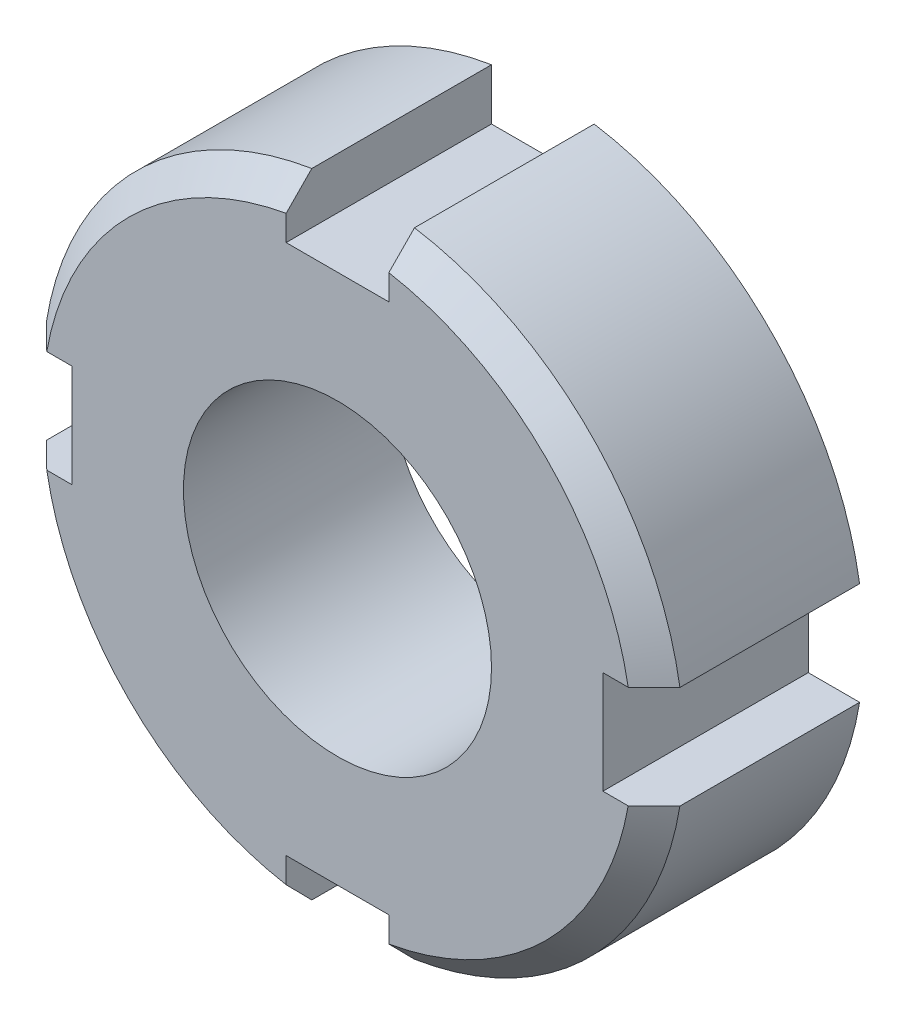
ISO-10303-21;
HEADER;
FILE_DESCRIPTION(('STEP AP214'),'2;1');
FILE_NAME('part.step','',(''),(''),'','','');
FILE_SCHEMA(('AUTOMOTIVE_DESIGN { 1 0 10303 214 1 1 1 1 }'));
ENDSEC;
DATA;
#1=APPLICATION_CONTEXT('core data for automotive mechanical design processes');
#2=APPLICATION_PROTOCOL_DEFINITION('international standard','automotive_design',2000,#1);
#3=PRODUCT_CONTEXT('',#1,'mechanical');
#4=PRODUCT('Part','Part','',(#3));
#5=PRODUCT_RELATED_PRODUCT_CATEGORY('part','',(#4));
#6=PRODUCT_DEFINITION_FORMATION('','',#4);
#7=PRODUCT_DEFINITION_CONTEXT('part definition',#1,'design');
#8=PRODUCT_DEFINITION('design','',#6,#7);
#9=PRODUCT_DEFINITION_SHAPE('','',#8);
#10=(LENGTH_UNIT() NAMED_UNIT(*) SI_UNIT(.MILLI.,.METRE.));
#11=(NAMED_UNIT(*) PLANE_ANGLE_UNIT() SI_UNIT($,.RADIAN.));
#12=(NAMED_UNIT(*) SI_UNIT($,.STERADIAN.) SOLID_ANGLE_UNIT());
#13=UNCERTAINTY_MEASURE_WITH_UNIT(LENGTH_MEASURE(1.E-05),#10,'distance_accuracy_value','');
#14=(GEOMETRIC_REPRESENTATION_CONTEXT(3) GLOBAL_UNCERTAINTY_ASSIGNED_CONTEXT((#13)) GLOBAL_UNIT_ASSIGNED_CONTEXT((#10,
#11,#12)) REPRESENTATION_CONTEXT('',''));
#15=CARTESIAN_POINT('',(0.,0.,0.));
#16=DIRECTION('',(0.,0.,1.));
#17=DIRECTION('',(1.,0.,0.));
#18=AXIS2_PLACEMENT_3D('',#15,#16,#17);
#19=CARTESIAN_POINT('',(0.,0.,8.));
#20=DIRECTION('',(0.,0.,-1.));
#21=DIRECTION('',(-1.,0.,0.));
#22=AXIS2_PLACEMENT_3D('',#19,#20,#21);
#23=CYLINDRICAL_SURFACE('',#22,12.5);
#24=DIRECTION('',(0.,0.,1.));
#25=VECTOR('',#24,1.);
#26=CARTESIAN_POINT('',(-12.338962679254,1.99999999999911,0.));
#27=LINE('',#26,#25);
#28=CARTESIAN_POINT('',(-12.338962679254,1.99999999999911,0.));
#29=VERTEX_POINT('',#28);
#30=CARTESIAN_POINT('',(-12.338962679254,1.99999999999911,6.99999999999999));
#31=VERTEX_POINT('',#30);
#32=EDGE_CURVE('E489',#29,#31,#27,.T.);
#33=ORIENTED_EDGE('',*,*,#32,.T.);
#34=CARTESIAN_POINT('',(0.,0.,6.99999999999999));
#35=DIRECTION('',(0.,0.,1.));
#36=DIRECTION('',(1.,0.,0.));
#37=AXIS2_PLACEMENT_3D('',#34,#35,#36);
#38=CIRCLE('',#37,12.5);
#39=CARTESIAN_POINT('',(-2.,12.3389626792531,6.99999999999999));
#40=VERTEX_POINT('',#39);
#41=EDGE_CURVE('E212',#31,#40,#38,.F.);
#42=ORIENTED_EDGE('',*,*,#41,.T.);
#43=DIRECTION('',(0.,0.,1.));
#44=VECTOR('',#43,1.);
#45=CARTESIAN_POINT('',(-2.,12.3389626792531,0.));
#46=LINE('',#45,#44);
#47=CARTESIAN_POINT('',(-2.,12.3389626792531,0.));
#48=VERTEX_POINT('',#47);
#49=EDGE_CURVE('E197',#48,#40,#46,.T.);
#50=ORIENTED_EDGE('',*,*,#49,.F.);
#51=CARTESIAN_POINT('',(0.,0.,0.));
#52=DIRECTION('',(0.,0.,1.));
#53=DIRECTION('',(1.,0.,0.));
#54=AXIS2_PLACEMENT_3D('',#51,#52,#53);
#55=CIRCLE('',#54,12.5);
#56=EDGE_CURVE('E215',#48,#29,#55,.T.);
#57=ORIENTED_EDGE('',*,*,#56,.T.);
#58=EDGE_LOOP('',(#33,#42,#50,#57));
#59=FACE_BOUND('',#58,.T.);
#60=ADVANCED_FACE('F49',(#59),#23,.T.);
#61=DIRECTION('',(0.,0.,1.));
#62=VECTOR('',#61,1.);
#63=CARTESIAN_POINT('',(2.,12.3389626792531,0.));
#64=LINE('',#63,#62);
#65=CARTESIAN_POINT('',(2.,12.3389626792531,0.));
#66=VERTEX_POINT('',#65);
#67=CARTESIAN_POINT('',(2.,12.3389626792531,6.99999999999999));
#68=VERTEX_POINT('',#67);
#69=EDGE_CURVE('E360',#66,#68,#64,.T.);
#70=ORIENTED_EDGE('',*,*,#69,.T.);
#71=CARTESIAN_POINT('',(0.,0.,6.99999999999999));
#72=DIRECTION('',(0.,0.,1.));
#73=DIRECTION('',(1.,0.,0.));
#74=AXIS2_PLACEMENT_3D('',#71,#72,#73);
#75=CIRCLE('',#74,12.5);
#76=CARTESIAN_POINT('',(12.338962679254,1.99999999999912,6.99999999999999));
#77=VERTEX_POINT('',#76);
#78=EDGE_CURVE('E68',#68,#77,#75,.F.);
#79=ORIENTED_EDGE('',*,*,#78,.T.);
#80=DIRECTION('',(0.,0.,1.));
#81=VECTOR('',#80,1.);
#82=CARTESIAN_POINT('',(12.338962679254,1.99999999999912,0.));
#83=LINE('',#82,#81);
#84=CARTESIAN_POINT('',(12.338962679254,1.99999999999912,0.));
#85=VERTEX_POINT('',#84);
#86=EDGE_CURVE('E399',#85,#77,#83,.T.);
#87=ORIENTED_EDGE('',*,*,#86,.F.);
#88=EDGE_CURVE('E224',#85,#66,#55,.T.);
#89=ORIENTED_EDGE('',*,*,#88,.T.);
#90=EDGE_LOOP('',(#70,#79,#87,#89));
#91=FACE_BOUND('',#90,.T.);
#92=ADVANCED_FACE('F346',(#91),#23,.T.);
#93=DIRECTION('',(0.,0.,1.));
#94=VECTOR('',#93,1.);
#95=CARTESIAN_POINT('',(12.338962679254,-2.00000000000088,0.));
#96=LINE('',#95,#94);
#97=CARTESIAN_POINT('',(12.338962679254,-2.00000000000088,0.));
#98=VERTEX_POINT('',#97);
#99=CARTESIAN_POINT('',(12.338962679254,-2.00000000000088,7.));
#100=VERTEX_POINT('',#99);
#101=EDGE_CURVE('E419',#98,#100,#96,.T.);
#102=ORIENTED_EDGE('',*,*,#101,.T.);
#103=CARTESIAN_POINT('',(0.,0.,7.));
#104=DIRECTION('',(0.,0.,1.));
#105=DIRECTION('',(1.,0.,0.));
#106=AXIS2_PLACEMENT_3D('',#103,#104,#105);
#107=CIRCLE('',#106,12.5);
#108=CARTESIAN_POINT('',(2.,-12.3389626792548,7.));
#109=VERTEX_POINT('',#108);
#110=EDGE_CURVE('E257',#100,#109,#107,.F.);
#111=ORIENTED_EDGE('',*,*,#110,.T.);
#112=DIRECTION('',(0.,0.,1.));
#113=VECTOR('',#112,1.);
#114=CARTESIAN_POINT('',(2.,-12.3389626792548,0.));
#115=LINE('',#114,#113);
#116=CARTESIAN_POINT('',(2.,-12.3389626792548,0.));
#117=VERTEX_POINT('',#116);
#118=EDGE_CURVE('E445',#117,#109,#115,.T.);
#119=ORIENTED_EDGE('',*,*,#118,.F.);
#120=EDGE_CURVE('E228',#117,#98,#55,.T.);
#121=ORIENTED_EDGE('',*,*,#120,.T.);
#122=EDGE_LOOP('',(#102,#111,#119,#121));
#123=FACE_BOUND('',#122,.T.);
#124=ADVANCED_FACE('F341',(#123),#23,.T.);
#125=DIRECTION('',(0.,0.,1.));
#126=VECTOR('',#125,1.);
#127=CARTESIAN_POINT('',(-2.,-12.3389626792548,0.));
#128=LINE('',#127,#126);
#129=CARTESIAN_POINT('',(-2.,-12.3389626792548,0.));
#130=VERTEX_POINT('',#129);
#131=CARTESIAN_POINT('',(-2.,-12.3389626792548,6.99999999999999));
#132=VERTEX_POINT('',#131);
#133=EDGE_CURVE('E452',#130,#132,#128,.T.);
#134=ORIENTED_EDGE('',*,*,#133,.T.);
#135=CARTESIAN_POINT('',(0.,0.,6.99999999999999));
#136=DIRECTION('',(0.,0.,1.));
#137=DIRECTION('',(1.,0.,0.));
#138=AXIS2_PLACEMENT_3D('',#135,#136,#137);
#139=CIRCLE('',#138,12.5);
#140=CARTESIAN_POINT('',(-12.338962679254,-2.00000000000089,6.99999999999999));
#141=VERTEX_POINT('',#140);
#142=EDGE_CURVE('E293',#132,#141,#139,.F.);
#143=ORIENTED_EDGE('',*,*,#142,.T.);
#144=DIRECTION('',(0.,0.,1.));
#145=VECTOR('',#144,1.);
#146=CARTESIAN_POINT('',(-12.338962679254,-2.00000000000089,0.));
#147=LINE('',#146,#145);
#148=CARTESIAN_POINT('',(-12.338962679254,-2.00000000000089,0.));
#149=VERTEX_POINT('',#148);
#150=EDGE_CURVE('E479',#149,#141,#147,.T.);
#151=ORIENTED_EDGE('',*,*,#150,.F.);
#152=EDGE_CURVE('E221',#149,#130,#55,.T.);
#153=ORIENTED_EDGE('',*,*,#152,.T.);
#154=EDGE_LOOP('',(#134,#143,#151,#153));
#155=FACE_BOUND('',#154,.T.);
#156=ADVANCED_FACE('F339',(#155),#23,.T.);
#157=CARTESIAN_POINT('',(0.,0.,8.));
#158=DIRECTION('',(0.,0.,1.));
#159=DIRECTION('',(1.,0.,0.));
#160=AXIS2_PLACEMENT_3D('',#157,#158,#159);
#161=PLANE('',#160);
#162=CARTESIAN_POINT('',(0.,0.,8.));
#163=DIRECTION('',(0.,0.,1.));
#164=DIRECTION('',(1.,0.,0.));
#165=AXIS2_PLACEMENT_3D('',#162,#163,#164);
#166=CIRCLE('',#165,6.);
#167=CARTESIAN_POINT('',(6.,0.,8.));
#168=VERTEX_POINT('',#167);
#169=EDGE_CURVE('E712',#168,#168,#166,.T.);
#170=ORIENTED_EDGE('',*,*,#169,.F.);
#171=EDGE_LOOP('',(#170));
#172=FACE_BOUND('',#171,.T.);
#173=DIRECTION('',(0.,1.,0.));
#174=VECTOR('',#173,1.);
#175=CARTESIAN_POINT('',(2.,-12.3389626792548,8.));
#176=LINE('',#175,#174);
#177=CARTESIAN_POINT('',(2.,-11.3247516529061,8.));
#178=VERTEX_POINT('',#177);
#179=CARTESIAN_POINT('',(2.,-10.3389626792548,8.));
#180=VERTEX_POINT('',#179);
#181=EDGE_CURVE('E424',#178,#180,#176,.T.);
#182=ORIENTED_EDGE('',*,*,#181,.F.);
#183=CARTESIAN_POINT('',(0.,0.,8.));
#184=DIRECTION('',(0.,0.,1.));
#185=DIRECTION('',(1.,0.,0.));
#186=AXIS2_PLACEMENT_3D('',#183,#184,#185);
#187=CIRCLE('',#186,11.5);
#188=CARTESIAN_POINT('',(11.324751652906,-2.00000000000088,8.));
#189=VERTEX_POINT('',#188);
#190=EDGE_CURVE('E249',#178,#189,#187,.T.);
#191=ORIENTED_EDGE('',*,*,#190,.T.);
#192=DIRECTION('',(1.,0.,0.));
#193=VECTOR('',#192,1.);
#194=CARTESIAN_POINT('',(10.338962679254,-2.00000000000088,8.));
#195=LINE('',#194,#193);
#196=CARTESIAN_POINT('',(10.338962679254,-2.00000000000088,8.));
#197=VERTEX_POINT('',#196);
#198=EDGE_CURVE('E422',#197,#189,#195,.T.);
#199=ORIENTED_EDGE('',*,*,#198,.F.);
#200=DIRECTION('',(0.,-1.,0.));
#201=VECTOR('',#200,1.);
#202=CARTESIAN_POINT('',(10.338962679254,1.99999999999911,8.));
#203=LINE('',#202,#201);
#204=CARTESIAN_POINT('',(10.338962679254,1.99999999999911,8.));
#205=VERTEX_POINT('',#204);
#206=EDGE_CURVE('E427',#205,#197,#203,.T.);
#207=ORIENTED_EDGE('',*,*,#206,.F.);
#208=DIRECTION('',(-1.,0.,0.));
#209=VECTOR('',#208,1.);
#210=CARTESIAN_POINT('',(12.338962679254,1.99999999999912,8.));
#211=LINE('',#210,#209);
#212=CARTESIAN_POINT('',(11.3247516529063,1.99999999999912,8.));
#213=VERTEX_POINT('',#212);
#214=EDGE_CURVE('E433',#213,#205,#211,.T.);
#215=ORIENTED_EDGE('',*,*,#214,.F.);
#216=CARTESIAN_POINT('',(0.,0.,8.));
#217=DIRECTION('',(0.,0.,1.));
#218=DIRECTION('',(1.,0.,0.));
#219=AXIS2_PLACEMENT_3D('',#216,#217,#218);
#220=CIRCLE('',#219,11.5);
#221=CARTESIAN_POINT('',(2.,11.3247516529061,8.));
#222=VERTEX_POINT('',#221);
#223=EDGE_CURVE('E226',#213,#222,#220,.T.);
#224=ORIENTED_EDGE('',*,*,#223,.T.);
#225=DIRECTION('',(0.,1.,0.));
#226=VECTOR('',#225,1.);
#227=CARTESIAN_POINT('',(2.,10.3389626792531,8.));
#228=LINE('',#227,#226);
#229=CARTESIAN_POINT('',(2.,10.3389626792531,8.));
#230=VERTEX_POINT('',#229);
#231=EDGE_CURVE('E210',#230,#222,#228,.T.);
#232=ORIENTED_EDGE('',*,*,#231,.F.);
#233=DIRECTION('',(1.,0.,0.));
#234=VECTOR('',#233,1.);
#235=CARTESIAN_POINT('',(-2.,10.3389626792531,8.));
#236=LINE('',#235,#234);
#237=CARTESIAN_POINT('',(-2.,10.3389626792531,8.));
#238=VERTEX_POINT('',#237);
#239=EDGE_CURVE('E539',#238,#230,#236,.T.);
#240=ORIENTED_EDGE('',*,*,#239,.F.);
#241=DIRECTION('',(0.,-1.,0.));
#242=VECTOR('',#241,1.);
#243=CARTESIAN_POINT('',(-2.,12.3389626792531,8.));
#244=LINE('',#243,#242);
#245=CARTESIAN_POINT('',(-2.,11.3247516529061,8.));
#246=VERTEX_POINT('',#245);
#247=EDGE_CURVE('E434',#246,#238,#244,.T.);
#248=ORIENTED_EDGE('',*,*,#247,.F.);
#249=CARTESIAN_POINT('',(0.,0.,8.));
#250=DIRECTION('',(0.,0.,1.));
#251=DIRECTION('',(1.,0.,0.));
#252=AXIS2_PLACEMENT_3D('',#249,#250,#251);
#253=CIRCLE('',#252,11.5);
#254=CARTESIAN_POINT('',(-11.3247516529063,1.99999999999911,8.));
#255=VERTEX_POINT('',#254);
#256=EDGE_CURVE('E239',#246,#255,#253,.T.);
#257=ORIENTED_EDGE('',*,*,#256,.T.);
#258=DIRECTION('',(-1.,0.,0.));
#259=VECTOR('',#258,1.);
#260=CARTESIAN_POINT('',(-10.338962679254,1.99999999999911,8.));
#261=LINE('',#260,#259);
#262=CARTESIAN_POINT('',(-10.338962679254,1.99999999999911,8.));
#263=VERTEX_POINT('',#262);
#264=EDGE_CURVE('E493',#263,#255,#261,.T.);
#265=ORIENTED_EDGE('',*,*,#264,.F.);
#266=DIRECTION('',(0.,1.,0.));
#267=VECTOR('',#266,1.);
#268=CARTESIAN_POINT('',(-10.338962679254,-2.00000000000089,8.));
#269=LINE('',#268,#267);
#270=CARTESIAN_POINT('',(-10.338962679254,-2.00000000000089,8.));
#271=VERTEX_POINT('',#270);
#272=EDGE_CURVE('E499',#271,#263,#269,.T.);
#273=ORIENTED_EDGE('',*,*,#272,.F.);
#274=DIRECTION('',(1.,0.,0.));
#275=VECTOR('',#274,1.);
#276=CARTESIAN_POINT('',(-12.338962679254,-2.00000000000089,8.));
#277=LINE('',#276,#275);
#278=CARTESIAN_POINT('',(-11.324751652906,-2.00000000000089,8.));
#279=VERTEX_POINT('',#278);
#280=EDGE_CURVE('E460',#279,#271,#277,.T.);
#281=ORIENTED_EDGE('',*,*,#280,.F.);
#282=CARTESIAN_POINT('',(0.,0.,8.));
#283=DIRECTION('',(0.,0.,1.));
#284=DIRECTION('',(1.,0.,0.));
#285=AXIS2_PLACEMENT_3D('',#282,#283,#284);
#286=CIRCLE('',#285,11.5);
#287=CARTESIAN_POINT('',(-2.,-11.3247516529061,8.));
#288=VERTEX_POINT('',#287);
#289=EDGE_CURVE('E244',#279,#288,#286,.T.);
#290=ORIENTED_EDGE('',*,*,#289,.T.);
#291=DIRECTION('',(0.,-1.,0.));
#292=VECTOR('',#291,1.);
#293=CARTESIAN_POINT('',(-2.,-10.3389626792548,8.));
#294=LINE('',#293,#292);
#295=CARTESIAN_POINT('',(-2.,-10.3389626792548,8.));
#296=VERTEX_POINT('',#295);
#297=EDGE_CURVE('E456',#296,#288,#294,.T.);
#298=ORIENTED_EDGE('',*,*,#297,.F.);
#299=DIRECTION('',(-1.,0.,0.));
#300=VECTOR('',#299,1.);
#301=CARTESIAN_POINT('',(2.,-10.3389626792548,8.));
#302=LINE('',#301,#300);
#303=EDGE_CURVE('E465',#180,#296,#302,.T.);
#304=ORIENTED_EDGE('',*,*,#303,.F.);
#305=EDGE_LOOP('',(#182,#191,#199,#207,#215,#224,#232,#240,#248,#257,#265,#273,#281,#290,#298,#304));
#306=FACE_BOUND('',#305,.T.);
#307=ADVANCED_FACE('F333',(#172,#306),#161,.T.);
#308=CARTESIAN_POINT('',(0.,0.,0.));
#309=DIRECTION('',(0.,0.,1.));
#310=DIRECTION('',(1.,0.,0.));
#311=AXIS2_PLACEMENT_3D('',#308,#309,#310);
#312=PLANE('',#311);
#313=CARTESIAN_POINT('',(0.,0.,0.));
#314=DIRECTION('',(0.,0.,1.));
#315=DIRECTION('',(1.,0.,0.));
#316=AXIS2_PLACEMENT_3D('',#313,#314,#315);
#317=CIRCLE('',#316,6.);
#318=CARTESIAN_POINT('',(6.,0.,0.));
#319=VERTEX_POINT('',#318);
#320=EDGE_CURVE('E492',#319,#319,#317,.T.);
#321=ORIENTED_EDGE('',*,*,#320,.T.);
#322=EDGE_LOOP('',(#321));
#323=FACE_BOUND('',#322,.T.);
#324=DIRECTION('',(1.,0.,0.));
#325=VECTOR('',#324,1.);
#326=CARTESIAN_POINT('',(-2.,10.3389626792531,0.));
#327=LINE('',#326,#325);
#328=CARTESIAN_POINT('',(-2.,10.3389626792531,0.));
#329=VERTEX_POINT('',#328);
#330=CARTESIAN_POINT('',(2.,10.3389626792531,0.));
#331=VERTEX_POINT('',#330);
#332=EDGE_CURVE('E206',#329,#331,#327,.T.);
#333=ORIENTED_EDGE('',*,*,#332,.T.);
#334=DIRECTION('',(0.,1.,0.));
#335=VECTOR('',#334,1.);
#336=CARTESIAN_POINT('',(2.,10.3389626792531,0.));
#337=LINE('',#336,#335);
#338=EDGE_CURVE('E216',#331,#66,#337,.T.);
#339=ORIENTED_EDGE('',*,*,#338,.T.);
#340=ORIENTED_EDGE('',*,*,#88,.F.);
#341=DIRECTION('',(-1.,0.,0.));
#342=VECTOR('',#341,1.);
#343=CARTESIAN_POINT('',(12.338962679254,1.99999999999912,0.));
#344=LINE('',#343,#342);
#345=CARTESIAN_POINT('',(10.338962679254,1.99999999999911,0.));
#346=VERTEX_POINT('',#345);
#347=EDGE_CURVE('E401',#85,#346,#344,.T.);
#348=ORIENTED_EDGE('',*,*,#347,.T.);
#349=DIRECTION('',(0.,-1.,0.));
#350=VECTOR('',#349,1.);
#351=CARTESIAN_POINT('',(10.338962679254,1.99999999999911,0.));
#352=LINE('',#351,#350);
#353=CARTESIAN_POINT('',(10.338962679254,-2.00000000000088,0.));
#354=VERTEX_POINT('',#353);
#355=EDGE_CURVE('E412',#346,#354,#352,.T.);
#356=ORIENTED_EDGE('',*,*,#355,.T.);
#357=DIRECTION('',(1.,0.,0.));
#358=VECTOR('',#357,1.);
#359=CARTESIAN_POINT('',(10.338962679254,-2.00000000000088,0.));
#360=LINE('',#359,#358);
#361=EDGE_CURVE('E403',#354,#98,#360,.T.);
#362=ORIENTED_EDGE('',*,*,#361,.T.);
#363=ORIENTED_EDGE('',*,*,#120,.F.);
#364=DIRECTION('',(0.,1.,0.));
#365=VECTOR('',#364,1.);
#366=CARTESIAN_POINT('',(2.,-12.3389626792548,0.));
#367=LINE('',#366,#365);
#368=CARTESIAN_POINT('',(2.,-10.3389626792548,0.));
#369=VERTEX_POINT('',#368);
#370=EDGE_CURVE('E464',#117,#369,#367,.T.);
#371=ORIENTED_EDGE('',*,*,#370,.T.);
#372=DIRECTION('',(-1.,0.,0.));
#373=VECTOR('',#372,1.);
#374=CARTESIAN_POINT('',(2.,-10.3389626792548,0.));
#375=LINE('',#374,#373);
#376=CARTESIAN_POINT('',(-2.,-10.3389626792548,0.));
#377=VERTEX_POINT('',#376);
#378=EDGE_CURVE('E472',#369,#377,#375,.T.);
#379=ORIENTED_EDGE('',*,*,#378,.T.);
#380=DIRECTION('',(0.,-1.,0.));
#381=VECTOR('',#380,1.);
#382=CARTESIAN_POINT('',(-2.,-10.3389626792548,0.));
#383=LINE('',#382,#381);
#384=EDGE_CURVE('E447',#377,#130,#383,.T.);
#385=ORIENTED_EDGE('',*,*,#384,.T.);
#386=ORIENTED_EDGE('',*,*,#152,.F.);
#387=DIRECTION('',(1.,0.,0.));
#388=VECTOR('',#387,1.);
#389=CARTESIAN_POINT('',(-12.338962679254,-2.00000000000089,0.));
#390=LINE('',#389,#388);
#391=CARTESIAN_POINT('',(-10.338962679254,-2.00000000000089,0.));
#392=VERTEX_POINT('',#391);
#393=EDGE_CURVE('E232',#149,#392,#390,.T.);
#394=ORIENTED_EDGE('',*,*,#393,.T.);
#395=DIRECTION('',(0.,1.,0.));
#396=VECTOR('',#395,1.);
#397=CARTESIAN_POINT('',(-10.338962679254,-2.00000000000089,0.));
#398=LINE('',#397,#396);
#399=CARTESIAN_POINT('',(-10.338962679254,1.99999999999911,0.));
#400=VERTEX_POINT('',#399);
#401=EDGE_CURVE('E503',#392,#400,#398,.T.);
#402=ORIENTED_EDGE('',*,*,#401,.T.);
#403=DIRECTION('',(-1.,0.,0.));
#404=VECTOR('',#403,1.);
#405=CARTESIAN_POINT('',(-10.338962679254,1.99999999999911,0.));
#406=LINE('',#405,#404);
#407=EDGE_CURVE('E222',#400,#29,#406,.T.);
#408=ORIENTED_EDGE('',*,*,#407,.T.);
#409=ORIENTED_EDGE('',*,*,#56,.F.);
#410=DIRECTION('',(0.,-1.,0.));
#411=VECTOR('',#410,1.);
#412=CARTESIAN_POINT('',(-2.,12.3389626792531,0.));
#413=LINE('',#412,#411);
#414=EDGE_CURVE('E191',#48,#329,#413,.T.);
#415=ORIENTED_EDGE('',*,*,#414,.T.);
#416=EDGE_LOOP('',(#333,#339,#340,#348,#356,#362,#363,#371,#379,#385,#386,#394,#402,#408,#409,#415));
#417=FACE_BOUND('',#416,.T.);
#418=ADVANCED_FACE('F218',(#323,#417),#312,.F.);
#419=CARTESIAN_POINT('',(-10.338962679254,1.99999999999911,0.));
#420=DIRECTION('',(0.,1.,0.));
#421=DIRECTION('',(-1.,0.,0.));
#422=AXIS2_PLACEMENT_3D('',#419,#420,#421);
#423=PLANE('',#422);
#424=ORIENTED_EDGE('',*,*,#264,.T.);
#425=CARTESIAN_POINT('',(-11.3247516529063,1.99999999999911,8.));
#426=CARTESIAN_POINT('',(-11.4938862036232,1.99999999999911,7.83343412402712));
#427=CARTESIAN_POINT('',(-11.6629710648233,1.99999999999911,7.66681785239851));
#428=CARTESIAN_POINT('',(-12.0010414069383,1.99999999999911,7.33348451906442));
#429=CARTESIAN_POINT('',(-12.1700268878537,1.99999999999911,7.16676745735969));
#430=CARTESIAN_POINT('',(-12.3389626792532,1.99999999999911,6.99999999999998));
#431=B_SPLINE_CURVE_WITH_KNOTS('',3,(#425,#426,#427,#428,#429,#430),.UNSPECIFIED.,.F.,.F.,(4,2,
4),(0.,0.712148896177298,1.42429778707948),.UNSPECIFIED.);
#432=EDGE_CURVE('E317',#255,#31,#431,.T.);
#433=ORIENTED_EDGE('',*,*,#432,.T.);
#434=ORIENTED_EDGE('',*,*,#32,.F.);
#435=ORIENTED_EDGE('',*,*,#407,.F.);
#436=DIRECTION('',(0.,0.,1.));
#437=VECTOR('',#436,1.);
#438=CARTESIAN_POINT('',(-10.338962679254,1.99999999999911,0.));
#439=LINE('',#438,#437);
#440=EDGE_CURVE('E490',#400,#263,#439,.T.);
#441=ORIENTED_EDGE('',*,*,#440,.T.);
#442=EDGE_LOOP('',(#424,#433,#434,#435,#441));
#443=FACE_BOUND('',#442,.T.);
#444=ADVANCED_FACE('F329',(#443),#423,.F.);
#445=CARTESIAN_POINT('',(-10.338962679254,-2.00000000000089,0.));
#446=DIRECTION('',(1.,0.,0.));
#447=DIRECTION('',(0.,0.,-1.));
#448=AXIS2_PLACEMENT_3D('',#445,#446,#447);
#449=PLANE('',#448);
#450=ORIENTED_EDGE('',*,*,#272,.T.);
#451=ORIENTED_EDGE('',*,*,#440,.F.);
#452=ORIENTED_EDGE('',*,*,#401,.F.);
#453=DIRECTION('',(0.,0.,1.));
#454=VECTOR('',#453,1.);
#455=CARTESIAN_POINT('',(-10.338962679254,-2.00000000000089,0.));
#456=LINE('',#455,#454);
#457=EDGE_CURVE('E483',#392,#271,#456,.T.);
#458=ORIENTED_EDGE('',*,*,#457,.T.);
#459=EDGE_LOOP('',(#450,#451,#452,#458));
#460=FACE_BOUND('',#459,.T.);
#461=ADVANCED_FACE('F310',(#460),#449,.F.);
#462=CARTESIAN_POINT('',(-12.338962679254,-2.00000000000089,0.));
#463=DIRECTION('',(0.,-1.,0.));
#464=DIRECTION('',(1.,0.,0.));
#465=AXIS2_PLACEMENT_3D('',#462,#463,#464);
#466=PLANE('',#465);
#467=ORIENTED_EDGE('',*,*,#150,.T.);
#468=CARTESIAN_POINT('',(-12.3389626792529,-2.00000000000073,6.99999999999999));
#469=CARTESIAN_POINT('',(-12.1700268878534,-2.00000000000081,7.16676745735969));
#470=CARTESIAN_POINT('',(-12.001041406938,-2.00000000000086,7.33348451906443));
#471=CARTESIAN_POINT('',(-11.662971064823,-2.00000000000092,7.66681785239851));
#472=CARTESIAN_POINT('',(-11.4938862036228,-2.00000000000092,7.83343412402711));
#473=CARTESIAN_POINT('',(-11.324751652906,-2.00000000000089,8.));
#474=B_SPLINE_CURVE_WITH_KNOTS('',3,(#468,#469,#470,#471,#472,#473),.UNSPECIFIED.,.F.,.F.,(4,2,
4),(0.,0.712148890902188,1.4242977870795),.UNSPECIFIED.);
#475=EDGE_CURVE('E315',#141,#279,#474,.T.);
#476=ORIENTED_EDGE('',*,*,#475,.T.);
#477=ORIENTED_EDGE('',*,*,#280,.T.);
#478=ORIENTED_EDGE('',*,*,#457,.F.);
#479=ORIENTED_EDGE('',*,*,#393,.F.);
#480=EDGE_LOOP('',(#467,#476,#477,#478,#479));
#481=FACE_BOUND('',#480,.T.);
#482=ADVANCED_FACE('F301',(#481),#466,.F.);
#483=CARTESIAN_POINT('',(-2.,-10.3389626792548,0.));
#484=DIRECTION('',(-1.,0.,0.));
#485=DIRECTION('',(0.,-1.,0.));
#486=AXIS2_PLACEMENT_3D('',#483,#484,#485);
#487=PLANE('',#486);
#488=ORIENTED_EDGE('',*,*,#297,.T.);
#489=CARTESIAN_POINT('',(-2.,-11.3247516529061,8.));
#490=CARTESIAN_POINT('',(-2.,-11.493886203623,7.83343412402711));
#491=CARTESIAN_POINT('',(-2.,-11.6629710648232,7.66681785239851));
#492=CARTESIAN_POINT('',(-2.,-12.0010414069381,7.33348451906442));
#493=CARTESIAN_POINT('',(-2.,-12.1700268878536,7.16676745735968));
#494=CARTESIAN_POINT('',(-2.,-12.3389626792531,6.99999999999997));
#495=B_SPLINE_CURVE_WITH_KNOTS('',3,(#489,#490,#491,#492,#493,#494),.UNSPECIFIED.,.F.,.F.,(4,2,
4),(0.,0.712148896177309,1.4242977870795),.UNSPECIFIED.);
#496=EDGE_CURVE('E286',#288,#132,#495,.T.);
#497=ORIENTED_EDGE('',*,*,#496,.T.);
#498=ORIENTED_EDGE('',*,*,#133,.F.);
#499=ORIENTED_EDGE('',*,*,#384,.F.);
#500=DIRECTION('',(0.,0.,1.));
#501=VECTOR('',#500,1.);
#502=CARTESIAN_POINT('',(-2.,-10.3389626792548,0.));
#503=LINE('',#502,#501);
#504=EDGE_CURVE('E453',#377,#296,#503,.T.);
#505=ORIENTED_EDGE('',*,*,#504,.T.);
#506=EDGE_LOOP('',(#488,#497,#498,#499,#505));
#507=FACE_BOUND('',#506,.T.);
#508=ADVANCED_FACE('F298',(#507),#487,.F.);
#509=CARTESIAN_POINT('',(2.,-10.3389626792548,0.));
#510=DIRECTION('',(0.,1.,0.));
#511=DIRECTION('',(0.,0.,1.));
#512=AXIS2_PLACEMENT_3D('',#509,#510,#511);
#513=PLANE('',#512);
#514=ORIENTED_EDGE('',*,*,#303,.T.);
#515=ORIENTED_EDGE('',*,*,#504,.F.);
#516=ORIENTED_EDGE('',*,*,#378,.F.);
#517=DIRECTION('',(0.,0.,1.));
#518=VECTOR('',#517,1.);
#519=CARTESIAN_POINT('',(2.,-10.3389626792548,0.));
#520=LINE('',#519,#518);
#521=EDGE_CURVE('E450',#369,#180,#520,.T.);
#522=ORIENTED_EDGE('',*,*,#521,.T.);
#523=EDGE_LOOP('',(#514,#515,#516,#522));
#524=FACE_BOUND('',#523,.T.);
#525=ADVANCED_FACE('F279',(#524),#513,.F.);
#526=CARTESIAN_POINT('',(2.,-12.3389626792548,0.));
#527=DIRECTION('',(1.,0.,0.));
#528=DIRECTION('',(0.,1.,0.));
#529=AXIS2_PLACEMENT_3D('',#526,#527,#528);
#530=PLANE('',#529);
#531=ORIENTED_EDGE('',*,*,#118,.T.);
#532=CARTESIAN_POINT('',(1.99999999999972,-12.3389626792531,7.));
#533=CARTESIAN_POINT('',(1.99999999999986,-12.1700268878536,7.1667674573597));
#534=CARTESIAN_POINT('',(1.99999999999996,-12.0010414069381,7.33348451906443));
#535=CARTESIAN_POINT('',(2.00000000000005,-11.6629710648232,7.66681785239851));
#536=CARTESIAN_POINT('',(2.00000000000005,-11.493886203623,7.83343412402711));
#537=CARTESIAN_POINT('',(2.,-11.3247516529061,8.));
#538=B_SPLINE_CURVE_WITH_KNOTS('',3,(#532,#533,#534,#535,#536,#537),.UNSPECIFIED.,.F.,.F.,(4,2,
4),(0.,0.712148890902187,1.42429778707949),.UNSPECIFIED.);
#539=EDGE_CURVE('E282',#109,#178,#538,.T.);
#540=ORIENTED_EDGE('',*,*,#539,.T.);
#541=ORIENTED_EDGE('',*,*,#181,.T.);
#542=ORIENTED_EDGE('',*,*,#521,.F.);
#543=ORIENTED_EDGE('',*,*,#370,.F.);
#544=EDGE_LOOP('',(#531,#540,#541,#542,#543));
#545=FACE_BOUND('',#544,.T.);
#546=ADVANCED_FACE('F272',(#545),#530,.F.);
#547=CARTESIAN_POINT('',(10.338962679254,-2.00000000000088,0.));
#548=DIRECTION('',(0.,-1.,0.));
#549=DIRECTION('',(1.,0.,0.));
#550=AXIS2_PLACEMENT_3D('',#547,#548,#549);
#551=PLANE('',#550);
#552=ORIENTED_EDGE('',*,*,#198,.T.);
#553=CARTESIAN_POINT('',(11.324751652906,-2.00000000000088,8.));
#554=CARTESIAN_POINT('',(11.4938862036228,-2.00000000000088,7.83343412402712));
#555=CARTESIAN_POINT('',(11.662971064823,-2.00000000000088,7.66681785239851));
#556=CARTESIAN_POINT('',(12.001041406938,-2.00000000000088,7.33348451906443));
#557=CARTESIAN_POINT('',(12.1700268878534,-2.00000000000088,7.16676745735969));
#558=CARTESIAN_POINT('',(12.3389626792529,-2.00000000000088,6.99999999999999));
#559=B_SPLINE_CURVE_WITH_KNOTS('',3,(#553,#554,#555,#556,#557,#558),.UNSPECIFIED.,.F.,.F.,(4,2,
4),(0.,0.712148896177304,1.42429778707949),.UNSPECIFIED.);
#560=EDGE_CURVE('E253',#189,#100,#559,.T.);
#561=ORIENTED_EDGE('',*,*,#560,.T.);
#562=ORIENTED_EDGE('',*,*,#101,.F.);
#563=ORIENTED_EDGE('',*,*,#361,.F.);
#564=DIRECTION('',(0.,0.,1.));
#565=VECTOR('',#564,1.);
#566=CARTESIAN_POINT('',(10.338962679254,-2.00000000000088,0.));
#567=LINE('',#566,#565);
#568=EDGE_CURVE('E411',#354,#197,#567,.T.);
#569=ORIENTED_EDGE('',*,*,#568,.T.);
#570=EDGE_LOOP('',(#552,#561,#562,#563,#569));
#571=FACE_BOUND('',#570,.T.);
#572=ADVANCED_FACE('F270',(#571),#551,.F.);
#573=CARTESIAN_POINT('',(10.338962679254,1.99999999999911,0.));
#574=DIRECTION('',(-1.,0.,0.));
#575=DIRECTION('',(0.,0.,1.));
#576=AXIS2_PLACEMENT_3D('',#573,#574,#575);
#577=PLANE('',#576);
#578=ORIENTED_EDGE('',*,*,#206,.T.);
#579=ORIENTED_EDGE('',*,*,#568,.F.);
#580=ORIENTED_EDGE('',*,*,#355,.F.);
#581=DIRECTION('',(0.,0.,1.));
#582=VECTOR('',#581,1.);
#583=CARTESIAN_POINT('',(10.338962679254,1.99999999999911,0.));
#584=LINE('',#583,#582);
#585=EDGE_CURVE('E407',#346,#205,#584,.T.);
#586=ORIENTED_EDGE('',*,*,#585,.T.);
#587=EDGE_LOOP('',(#578,#579,#580,#586));
#588=FACE_BOUND('',#587,.T.);
#589=ADVANCED_FACE('F275',(#588),#577,.F.);
#590=CARTESIAN_POINT('',(12.338962679254,1.99999999999912,0.));
#591=DIRECTION('',(0.,1.,0.));
#592=DIRECTION('',(-1.,0.,0.));
#593=AXIS2_PLACEMENT_3D('',#590,#591,#592);
#594=PLANE('',#593);
#595=ORIENTED_EDGE('',*,*,#86,.T.);
#596=CARTESIAN_POINT('',(12.3389626792532,1.999999999999,6.99999999999999));
#597=CARTESIAN_POINT('',(12.1700268878537,1.99999999999906,7.16676745735969));
#598=CARTESIAN_POINT('',(12.0010414069383,1.9999999999991,7.33348451906443));
#599=CARTESIAN_POINT('',(11.6629710648233,1.99999999999914,7.66681785239851));
#600=CARTESIAN_POINT('',(11.4938862036232,1.99999999999914,7.83343412402711));
#601=CARTESIAN_POINT('',(11.3247516529063,1.99999999999912,8.));
#602=B_SPLINE_CURVE_WITH_KNOTS('',3,(#596,#597,#598,#599,#600,#601),.UNSPECIFIED.,.F.,.F.,(4,2,
4),(0.,0.712148890902177,1.42429778707947),.UNSPECIFIED.);
#603=EDGE_CURVE('E11',#77,#213,#602,.T.);
#604=ORIENTED_EDGE('',*,*,#603,.T.);
#605=ORIENTED_EDGE('',*,*,#214,.T.);
#606=ORIENTED_EDGE('',*,*,#585,.F.);
#607=ORIENTED_EDGE('',*,*,#347,.F.);
#608=EDGE_LOOP('',(#595,#604,#605,#606,#607));
#609=FACE_BOUND('',#608,.T.);
#610=ADVANCED_FACE('F390',(#609),#594,.F.);
#611=CARTESIAN_POINT('',(2.,10.3389626792531,0.));
#612=DIRECTION('',(1.,0.,0.));
#613=DIRECTION('',(0.,1.,0.));
#614=AXIS2_PLACEMENT_3D('',#611,#612,#613);
#615=PLANE('',#614);
#616=ORIENTED_EDGE('',*,*,#231,.T.);
#617=CARTESIAN_POINT('',(2.,11.3247516529061,8.));
#618=CARTESIAN_POINT('',(2.,11.493886203623,7.83343412402712));
#619=CARTESIAN_POINT('',(2.,11.6629710648232,7.66681785239851));
#620=CARTESIAN_POINT('',(2.,12.0010414069381,7.33348451906443));
#621=CARTESIAN_POINT('',(2.,12.1700268878536,7.16676745735969));
#622=CARTESIAN_POINT('',(2.,12.3389626792531,6.99999999999999));
#623=B_SPLINE_CURVE_WITH_KNOTS('',3,(#617,#618,#619,#620,#621,#622),.UNSPECIFIED.,.F.,.F.,(4,2,
4),(0.,0.712148896177295,1.42429778707947),.UNSPECIFIED.);
#624=EDGE_CURVE('E78',#222,#68,#623,.T.);
#625=ORIENTED_EDGE('',*,*,#624,.T.);
#626=ORIENTED_EDGE('',*,*,#69,.F.);
#627=ORIENTED_EDGE('',*,*,#338,.F.);
#628=DIRECTION('',(0.,0.,1.));
#629=VECTOR('',#628,1.);
#630=CARTESIAN_POINT('',(2.,10.3389626792531,0.));
#631=LINE('',#630,#629);
#632=EDGE_CURVE('E362',#331,#230,#631,.T.);
#633=ORIENTED_EDGE('',*,*,#632,.T.);
#634=EDGE_LOOP('',(#616,#625,#626,#627,#633));
#635=FACE_BOUND('',#634,.T.);
#636=ADVANCED_FACE('F381',(#635),#615,.F.);
#637=CARTESIAN_POINT('',(-2.,10.3389626792531,0.));
#638=DIRECTION('',(0.,-1.,0.));
#639=DIRECTION('',(0.,0.,-1.));
#640=AXIS2_PLACEMENT_3D('',#637,#638,#639);
#641=PLANE('',#640);
#642=ORIENTED_EDGE('',*,*,#239,.T.);
#643=ORIENTED_EDGE('',*,*,#632,.F.);
#644=ORIENTED_EDGE('',*,*,#332,.F.);
#645=DIRECTION('',(0.,0.,1.));
#646=VECTOR('',#645,1.);
#647=CARTESIAN_POINT('',(-2.,10.3389626792531,0.));
#648=LINE('',#647,#646);
#649=EDGE_CURVE('E199',#329,#238,#648,.T.);
#650=ORIENTED_EDGE('',*,*,#649,.T.);
#651=EDGE_LOOP('',(#642,#643,#644,#650));
#652=FACE_BOUND('',#651,.T.);
#653=ADVANCED_FACE('F387',(#652),#641,.F.);
#654=CARTESIAN_POINT('',(-2.,12.3389626792531,0.));
#655=DIRECTION('',(-1.,0.,0.));
#656=DIRECTION('',(0.,-1.,0.));
#657=AXIS2_PLACEMENT_3D('',#654,#655,#656);
#658=PLANE('',#657);
#659=ORIENTED_EDGE('',*,*,#49,.T.);
#660=CARTESIAN_POINT('',(-2.,12.3389626792531,6.99999999999999));
#661=CARTESIAN_POINT('',(-2.,12.1700268878536,7.1667674573597));
#662=CARTESIAN_POINT('',(-2.,12.0010414069381,7.33348451906443));
#663=CARTESIAN_POINT('',(-2.,11.6629710648232,7.66681785239851));
#664=CARTESIAN_POINT('',(-2.,11.493886203623,7.83343412402712));
#665=CARTESIAN_POINT('',(-2.,11.3247516529061,8.));
#666=B_SPLINE_CURVE_WITH_KNOTS('',3,(#660,#661,#662,#663,#664,#665),.UNSPECIFIED.,.F.,.F.,(4,2,
4),(0.,0.712148890902175,1.42429778707947),.UNSPECIFIED.);
#667=EDGE_CURVE('E369',#40,#246,#666,.T.);
#668=ORIENTED_EDGE('',*,*,#667,.T.);
#669=ORIENTED_EDGE('',*,*,#247,.T.);
#670=ORIENTED_EDGE('',*,*,#649,.F.);
#671=ORIENTED_EDGE('',*,*,#414,.F.);
#672=EDGE_LOOP('',(#659,#668,#669,#670,#671));
#673=FACE_BOUND('',#672,.T.);
#674=ADVANCED_FACE('F198',(#673),#658,.F.);
#675=CARTESIAN_POINT('',(0.,0.,0.));
#676=DIRECTION('',(0.,0.,1.));
#677=DIRECTION('',(1.,0.,0.));
#678=AXIS2_PLACEMENT_3D('',#675,#676,#677);
#679=CYLINDRICAL_SURFACE('',#678,6.);
#680=ORIENTED_EDGE('',*,*,#320,.F.);
#681=EDGE_LOOP('',(#680));
#682=FACE_BOUND('',#681,.T.);
#683=ORIENTED_EDGE('',*,*,#169,.T.);
#684=EDGE_LOOP('',(#683));
#685=FACE_BOUND('',#684,.T.);
#686=ADVANCED_FACE('F389',(#682,#685),#679,.F.);
#687=CARTESIAN_POINT('',(0.,0.,8.));
#688=DIRECTION('',(0.,0.,-1.));
#689=DIRECTION('',(-1.,0.,0.));
#690=AXIS2_PLACEMENT_3D('',#687,#688,#689);
#691=CONICAL_SURFACE('',#690,11.5,0.78539816339745);
#692=ORIENTED_EDGE('',*,*,#539,.F.);
#693=ORIENTED_EDGE('',*,*,#110,.F.);
#694=ORIENTED_EDGE('',*,*,#560,.F.);
#695=ORIENTED_EDGE('',*,*,#190,.F.);
#696=EDGE_LOOP('',(#692,#693,#694,#695));
#697=FACE_BOUND('',#696,.T.);
#698=ADVANCED_FACE('F263',(#697),#691,.T.);
#699=CARTESIAN_POINT('',(0.,0.,8.));
#700=DIRECTION('',(0.,0.,-1.));
#701=DIRECTION('',(-1.,0.,0.));
#702=AXIS2_PLACEMENT_3D('',#699,#700,#701);
#703=CONICAL_SURFACE('',#702,11.5,0.785398163397447);
#704=ORIENTED_EDGE('',*,*,#475,.F.);
#705=ORIENTED_EDGE('',*,*,#142,.F.);
#706=ORIENTED_EDGE('',*,*,#496,.F.);
#707=ORIENTED_EDGE('',*,*,#289,.F.);
#708=EDGE_LOOP('',(#704,#705,#706,#707));
#709=FACE_BOUND('',#708,.T.);
#710=ADVANCED_FACE('F299',(#709),#703,.T.);
#711=CARTESIAN_POINT('',(0.,0.,8.));
#712=DIRECTION('',(0.,0.,-1.));
#713=DIRECTION('',(-1.,0.,0.));
#714=AXIS2_PLACEMENT_3D('',#711,#712,#713);
#715=CONICAL_SURFACE('',#714,11.5,0.785398163397447);
#716=ORIENTED_EDGE('',*,*,#667,.F.);
#717=ORIENTED_EDGE('',*,*,#41,.F.);
#718=ORIENTED_EDGE('',*,*,#432,.F.);
#719=ORIENTED_EDGE('',*,*,#256,.F.);
#720=EDGE_LOOP('',(#716,#717,#718,#719));
#721=FACE_BOUND('',#720,.T.);
#722=ADVANCED_FACE('F327',(#721),#715,.T.);
#723=CARTESIAN_POINT('',(0.,0.,8.));
#724=DIRECTION('',(0.,0.,-1.));
#725=DIRECTION('',(-1.,0.,0.));
#726=AXIS2_PLACEMENT_3D('',#723,#724,#725);
#727=CONICAL_SURFACE('',#726,11.5,0.785398163397446);
#728=ORIENTED_EDGE('',*,*,#603,.F.);
#729=ORIENTED_EDGE('',*,*,#78,.F.);
#730=ORIENTED_EDGE('',*,*,#624,.F.);
#731=ORIENTED_EDGE('',*,*,#223,.F.);
#732=EDGE_LOOP('',(#728,#729,#730,#731));
#733=FACE_BOUND('',#732,.T.);
#734=ADVANCED_FACE('F52',(#733),#727,.T.);
#735=CLOSED_SHELL('',(#60,#92,#124,#156,#307,#418,#444,#461,#482,#508,#525,#546,#572,#589,#610,
#636,#653,#674,#686,#698,#710,#722,#734));
#736=MANIFOLD_SOLID_BREP('B2',#735);
#737=ADVANCED_BREP_SHAPE_REPRESENTATION('',(#18,#736),#14);
#738=SHAPE_DEFINITION_REPRESENTATION(#9,#737);
ENDSEC;
END-ISO-10303-21;
